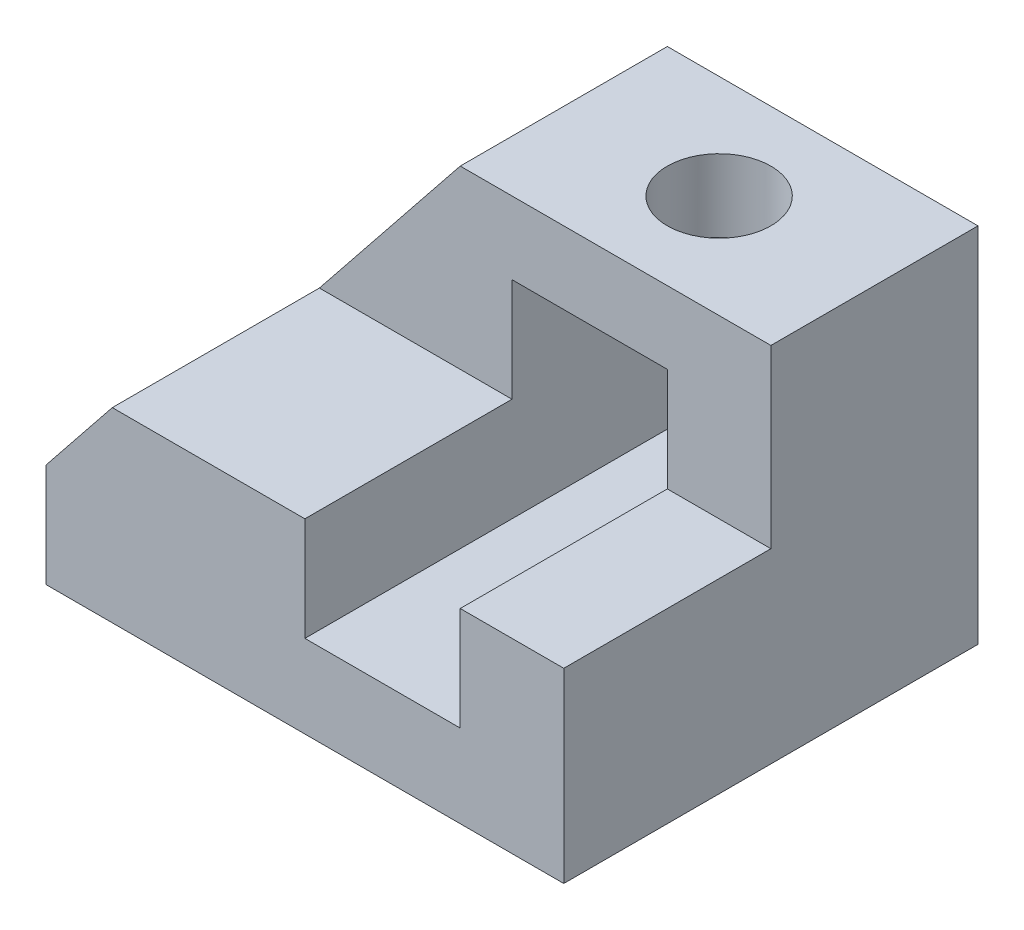
ISO-10303-21;
HEADER;
FILE_DESCRIPTION(('STEP AP214'),'2;1');
FILE_NAME('part.step','',(''),(''),'','','');
FILE_SCHEMA(('AUTOMOTIVE_DESIGN { 1 0 10303 214 1 1 1 1 }'));
ENDSEC;
DATA;
#1=APPLICATION_CONTEXT('core data for automotive mechanical design processes');
#2=APPLICATION_PROTOCOL_DEFINITION('international standard','automotive_design',2000,#1);
#3=PRODUCT_CONTEXT('',#1,'mechanical');
#4=PRODUCT('Part','Part','',(#3));
#5=PRODUCT_RELATED_PRODUCT_CATEGORY('part','',(#4));
#6=PRODUCT_DEFINITION_FORMATION('','',#4);
#7=PRODUCT_DEFINITION_CONTEXT('part definition',#1,'design');
#8=PRODUCT_DEFINITION('design','',#6,#7);
#9=PRODUCT_DEFINITION_SHAPE('','',#8);
#10=(LENGTH_UNIT() NAMED_UNIT(*) SI_UNIT(.MILLI.,.METRE.));
#11=(NAMED_UNIT(*) PLANE_ANGLE_UNIT() SI_UNIT($,.RADIAN.));
#12=(NAMED_UNIT(*) SI_UNIT($,.STERADIAN.) SOLID_ANGLE_UNIT());
#13=UNCERTAINTY_MEASURE_WITH_UNIT(LENGTH_MEASURE(1.E-05),#10,'distance_accuracy_value','');
#14=(GEOMETRIC_REPRESENTATION_CONTEXT(3) GLOBAL_UNCERTAINTY_ASSIGNED_CONTEXT((#13)) GLOBAL_UNIT_ASSIGNED_CONTEXT((#10,
#11,#12)) REPRESENTATION_CONTEXT('',''));
#15=CARTESIAN_POINT('',(0.,0.,0.));
#16=DIRECTION('',(0.,0.,1.));
#17=DIRECTION('',(1.,0.,0.));
#18=AXIS2_PLACEMENT_3D('',#15,#16,#17);
#19=CARTESIAN_POINT('',(0.,18.,40.));
#20=DIRECTION('',(0.,1.,0.));
#21=DIRECTION('',(0.,0.,1.));
#22=AXIS2_PLACEMENT_3D('',#19,#20,#21);
#23=PLANE('',#22);
#24=DIRECTION('',(1.,0.,0.));
#25=VECTOR('',#24,1.);
#26=CARTESIAN_POINT('',(0.,18.,20.));
#27=LINE('',#26,#25);
#28=CARTESIAN_POINT('',(40.,18.,20.));
#29=VERTEX_POINT('',#28);
#30=CARTESIAN_POINT('',(50.,18.,20.));
#31=VERTEX_POINT('',#30);
#32=EDGE_CURVE('E167',#29,#31,#27,.T.);
#33=ORIENTED_EDGE('',*,*,#32,.F.);
#34=DIRECTION('',(0.,0.,-1.));
#35=VECTOR('',#34,1.);
#36=CARTESIAN_POINT('',(40.,18.,40.));
#37=LINE('',#36,#35);
#38=CARTESIAN_POINT('',(40.,18.,40.));
#39=VERTEX_POINT('',#38);
#40=EDGE_CURVE('E13',#39,#29,#37,.T.);
#41=ORIENTED_EDGE('',*,*,#40,.F.);
#42=DIRECTION('',(1.,0.,0.));
#43=VECTOR('',#42,1.);
#44=CARTESIAN_POINT('',(0.,18.,40.));
#45=LINE('',#44,#43);
#46=CARTESIAN_POINT('',(50.,18.,40.));
#47=VERTEX_POINT('',#46);
#48=EDGE_CURVE('E191',#39,#47,#45,.T.);
#49=ORIENTED_EDGE('',*,*,#48,.T.);
#50=DIRECTION('',(0.,0.,-1.));
#51=VECTOR('',#50,1.);
#52=CARTESIAN_POINT('',(50.,18.,40.));
#53=LINE('',#52,#51);
#54=EDGE_CURVE('E211',#47,#31,#53,.T.);
#55=ORIENTED_EDGE('',*,*,#54,.T.);
#56=EDGE_LOOP('',(#33,#41,#49,#55));
#57=FACE_BOUND('',#56,.T.);
#58=ADVANCED_FACE('F61',(#57),#23,.T.);
#59=CARTESIAN_POINT('',(40.,0.,40.));
#60=DIRECTION('',(1.,0.,0.));
#61=DIRECTION('',(0.,0.,-1.));
#62=AXIS2_PLACEMENT_3D('',#59,#60,#61);
#63=PLANE('',#62);
#64=DIRECTION('',(0.,0.,-1.));
#65=VECTOR('',#64,1.);
#66=CARTESIAN_POINT('',(40.,8.,40.));
#67=LINE('',#66,#65);
#68=CARTESIAN_POINT('',(40.,8.,10.));
#69=VERTEX_POINT('',#68);
#70=CARTESIAN_POINT('',(40.,8.,0.));
#71=VERTEX_POINT('',#70);
#72=EDGE_CURVE('E243',#69,#71,#67,.T.);
#73=ORIENTED_EDGE('',*,*,#72,.F.);
#74=CARTESIAN_POINT('',(40.,8.,40.));
#75=VERTEX_POINT('',#74);
#76=EDGE_CURVE('E69',#75,#69,#67,.T.);
#77=ORIENTED_EDGE('',*,*,#76,.F.);
#78=DIRECTION('',(0.,-1.,0.));
#79=VECTOR('',#78,1.);
#80=CARTESIAN_POINT('',(40.,0.,40.));
#81=LINE('',#80,#79);
#82=EDGE_CURVE('E194',#39,#75,#81,.T.);
#83=ORIENTED_EDGE('',*,*,#82,.F.);
#84=ORIENTED_EDGE('',*,*,#40,.T.);
#85=DIRECTION('',(0.,-1.,0.));
#86=VECTOR('',#85,1.);
#87=CARTESIAN_POINT('',(40.,0.,20.));
#88=LINE('',#87,#86);
#89=CARTESIAN_POINT('',(40.,28.,20.));
#90=VERTEX_POINT('',#89);
#91=EDGE_CURVE('E159',#90,#29,#88,.T.);
#92=ORIENTED_EDGE('',*,*,#91,.F.);
#93=DIRECTION('',(0.,0.,-1.));
#94=VECTOR('',#93,1.);
#95=CARTESIAN_POINT('',(40.,28.,20.));
#96=LINE('',#95,#94);
#97=CARTESIAN_POINT('',(40.,28.,10.));
#98=VERTEX_POINT('',#97);
#99=EDGE_CURVE('E163',#90,#98,#96,.T.);
#100=ORIENTED_EDGE('',*,*,#99,.T.);
#101=CARTESIAN_POINT('',(40.,28.,0.));
#102=VERTEX_POINT('',#101);
#103=EDGE_CURVE('E182',#98,#102,#96,.T.);
#104=ORIENTED_EDGE('',*,*,#103,.T.);
#105=DIRECTION('',(0.,-1.,0.));
#106=VECTOR('',#105,1.);
#107=CARTESIAN_POINT('',(40.,0.,0.));
#108=LINE('',#107,#106);
#109=EDGE_CURVE('E181',#102,#71,#108,.T.);
#110=ORIENTED_EDGE('',*,*,#109,.T.);
#111=EDGE_LOOP('',(#73,#77,#83,#84,#92,#100,#104,#110));
#112=FACE_BOUND('',#111,.T.);
#113=ADVANCED_FACE('F63',(#112),#63,.F.);
#114=CARTESIAN_POINT('',(0.,8.,40.));
#115=DIRECTION('',(0.,1.,0.));
#116=DIRECTION('',(0.,0.,1.));
#117=AXIS2_PLACEMENT_3D('',#114,#115,#116);
#118=PLANE('',#117);
#119=ORIENTED_EDGE('',*,*,#76,.T.);
#120=CARTESIAN_POINT('',(35.,8.,10.));
#121=DIRECTION('',(0.,1.,0.));
#122=DIRECTION('',(0.,0.,1.));
#123=AXIS2_PLACEMENT_3D('',#120,#121,#122);
#124=CIRCLE('',#123,5.);
#125=EDGE_CURVE('E74',#69,#69,#124,.T.);
#126=ORIENTED_EDGE('',*,*,#125,.F.);
#127=ORIENTED_EDGE('',*,*,#72,.T.);
#128=DIRECTION('',(1.,0.,0.));
#129=VECTOR('',#128,1.);
#130=CARTESIAN_POINT('',(0.,8.,0.));
#131=LINE('',#130,#129);
#132=CARTESIAN_POINT('',(25.,8.,0.));
#133=VERTEX_POINT('',#132);
#134=EDGE_CURVE('E185',#133,#71,#131,.T.);
#135=ORIENTED_EDGE('',*,*,#134,.F.);
#136=DIRECTION('',(0.,0.,-1.));
#137=VECTOR('',#136,1.);
#138=CARTESIAN_POINT('',(25.,8.,40.));
#139=LINE('',#138,#137);
#140=CARTESIAN_POINT('',(25.,8.,40.));
#141=VERTEX_POINT('',#140);
#142=EDGE_CURVE('E242',#141,#133,#139,.T.);
#143=ORIENTED_EDGE('',*,*,#142,.F.);
#144=DIRECTION('',(1.,0.,0.));
#145=VECTOR('',#144,1.);
#146=CARTESIAN_POINT('',(0.,8.,40.));
#147=LINE('',#146,#145);
#148=EDGE_CURVE('E198',#141,#75,#147,.T.);
#149=ORIENTED_EDGE('',*,*,#148,.T.);
#150=EDGE_LOOP('',(#119,#126,#127,#135,#143,#149));
#151=FACE_BOUND('',#150,.T.);
#152=ADVANCED_FACE('F248',(#151),#118,.T.);
#153=CARTESIAN_POINT('',(25.,0.,40.));
#154=DIRECTION('',(1.,0.,0.));
#155=DIRECTION('',(0.,1.,0.));
#156=AXIS2_PLACEMENT_3D('',#153,#154,#155);
#157=PLANE('',#156);
#158=DIRECTION('',(0.,-1.,0.));
#159=VECTOR('',#158,1.);
#160=CARTESIAN_POINT('',(25.,0.,0.));
#161=LINE('',#160,#159);
#162=CARTESIAN_POINT('',(25.,28.,0.));
#163=VERTEX_POINT('',#162);
#164=EDGE_CURVE('E215',#163,#133,#161,.T.);
#165=ORIENTED_EDGE('',*,*,#164,.F.);
#166=DIRECTION('',(0.,0.,-1.));
#167=VECTOR('',#166,1.);
#168=CARTESIAN_POINT('',(25.,28.,20.));
#169=LINE('',#168,#167);
#170=CARTESIAN_POINT('',(25.,28.,20.));
#171=VERTEX_POINT('',#170);
#172=EDGE_CURVE('E257',#171,#163,#169,.T.);
#173=ORIENTED_EDGE('',*,*,#172,.F.);
#174=DIRECTION('',(0.,-1.,0.));
#175=VECTOR('',#174,1.);
#176=CARTESIAN_POINT('',(25.,0.,20.));
#177=LINE('',#176,#175);
#178=CARTESIAN_POINT('',(25.,18.,20.));
#179=VERTEX_POINT('',#178);
#180=EDGE_CURVE('E174',#171,#179,#177,.T.);
#181=ORIENTED_EDGE('',*,*,#180,.T.);
#182=DIRECTION('',(0.,0.,-1.));
#183=VECTOR('',#182,1.);
#184=CARTESIAN_POINT('',(25.,18.,40.));
#185=LINE('',#184,#183);
#186=CARTESIAN_POINT('',(25.,18.,40.));
#187=VERTEX_POINT('',#186);
#188=EDGE_CURVE('E239',#187,#179,#185,.T.);
#189=ORIENTED_EDGE('',*,*,#188,.F.);
#190=DIRECTION('',(0.,-1.,0.));
#191=VECTOR('',#190,1.);
#192=CARTESIAN_POINT('',(25.,0.,40.));
#193=LINE('',#192,#191);
#194=EDGE_CURVE('E201',#187,#141,#193,.T.);
#195=ORIENTED_EDGE('',*,*,#194,.T.);
#196=ORIENTED_EDGE('',*,*,#142,.T.);
#197=EDGE_LOOP('',(#165,#173,#181,#189,#195,#196));
#198=FACE_BOUND('',#197,.T.);
#199=ADVANCED_FACE('F256',(#198),#157,.T.);
#200=CARTESIAN_POINT('',(6.4,18.,20.));
#201=VERTEX_POINT('',#200);
#202=EDGE_CURVE('E261',#201,#179,#27,.T.);
#203=ORIENTED_EDGE('',*,*,#202,.F.);
#204=DIRECTION('',(0.,0.,-1.));
#205=VECTOR('',#204,1.);
#206=CARTESIAN_POINT('',(6.4,18.,40.));
#207=LINE('',#206,#205);
#208=CARTESIAN_POINT('',(6.4,18.,40.));
#209=VERTEX_POINT('',#208);
#210=EDGE_CURVE('E236',#209,#201,#207,.T.);
#211=ORIENTED_EDGE('',*,*,#210,.F.);
#212=EDGE_CURVE('E196',#209,#187,#45,.T.);
#213=ORIENTED_EDGE('',*,*,#212,.T.);
#214=ORIENTED_EDGE('',*,*,#188,.T.);
#215=EDGE_LOOP('',(#203,#211,#213,#214));
#216=FACE_BOUND('',#215,.T.);
#217=ADVANCED_FACE('F298',(#216),#23,.T.);
#218=CARTESIAN_POINT('',(-4.87804878048781,3.90243902439025,40.));
#219=DIRECTION('',(0.78086880944303,-0.624695047554425,0.));
#220=DIRECTION('',(0.624695047554425,0.78086880944303,0.));
#221=AXIS2_PLACEMENT_3D('',#218,#219,#220);
#222=PLANE('',#221);
#223=DIRECTION('',(-0.624695047554425,-0.78086880944303,0.));
#224=VECTOR('',#223,1.);
#225=CARTESIAN_POINT('',(-4.87804878048781,3.90243902439025,0.));
#226=LINE('',#225,#224);
#227=CARTESIAN_POINT('',(20.,35.,0.));
#228=VERTEX_POINT('',#227);
#229=CARTESIAN_POINT('',(0.,10.,0.));
#230=VERTEX_POINT('',#229);
#231=EDGE_CURVE('E218',#228,#230,#226,.T.);
#232=ORIENTED_EDGE('',*,*,#231,.T.);
#233=DIRECTION('',(0.,0.,-1.));
#234=VECTOR('',#233,1.);
#235=CARTESIAN_POINT('',(0.,10.,40.));
#236=LINE('',#235,#234);
#237=CARTESIAN_POINT('',(0.,10.,40.));
#238=VERTEX_POINT('',#237);
#239=EDGE_CURVE('E233',#238,#230,#236,.T.);
#240=ORIENTED_EDGE('',*,*,#239,.F.);
#241=DIRECTION('',(-0.624695047554425,-0.78086880944303,0.));
#242=VECTOR('',#241,1.);
#243=CARTESIAN_POINT('',(-4.87804878048781,3.90243902439025,40.));
#244=LINE('',#243,#242);
#245=EDGE_CURVE('E204',#209,#238,#244,.T.);
#246=ORIENTED_EDGE('',*,*,#245,.F.);
#247=ORIENTED_EDGE('',*,*,#210,.T.);
#248=DIRECTION('',(-0.624695047554425,-0.78086880944303,0.));
#249=VECTOR('',#248,1.);
#250=CARTESIAN_POINT('',(-4.87804878048781,3.90243902439025,20.));
#251=LINE('',#250,#249);
#252=CARTESIAN_POINT('',(20.,35.,20.));
#253=VERTEX_POINT('',#252);
#254=EDGE_CURVE('E267',#253,#201,#251,.T.);
#255=ORIENTED_EDGE('',*,*,#254,.F.);
#256=DIRECTION('',(0.,0.,-1.));
#257=VECTOR('',#256,1.);
#258=CARTESIAN_POINT('',(20.,35.,20.));
#259=LINE('',#258,#257);
#260=EDGE_CURVE('E258',#253,#228,#259,.T.);
#261=ORIENTED_EDGE('',*,*,#260,.T.);
#262=EDGE_LOOP('',(#232,#240,#246,#247,#255,#261));
#263=FACE_BOUND('',#262,.T.);
#264=ADVANCED_FACE('F307',(#263),#222,.F.);
#265=CARTESIAN_POINT('',(0.,0.,40.));
#266=DIRECTION('',(1.,0.,0.));
#267=DIRECTION('',(0.,1.,0.));
#268=AXIS2_PLACEMENT_3D('',#265,#266,#267);
#269=PLANE('',#268);
#270=DIRECTION('',(0.,-1.,0.));
#271=VECTOR('',#270,1.);
#272=CARTESIAN_POINT('',(0.,0.,0.));
#273=LINE('',#272,#271);
#274=CARTESIAN_POINT('',(0.,0.,0.));
#275=VERTEX_POINT('',#274);
#276=EDGE_CURVE('E220',#230,#275,#273,.T.);
#277=ORIENTED_EDGE('',*,*,#276,.T.);
#278=DIRECTION('',(0.,0.,-1.));
#279=VECTOR('',#278,1.);
#280=CARTESIAN_POINT('',(0.,0.,40.));
#281=LINE('',#280,#279);
#282=CARTESIAN_POINT('',(0.,0.,40.));
#283=VERTEX_POINT('',#282);
#284=EDGE_CURVE('E230',#283,#275,#281,.T.);
#285=ORIENTED_EDGE('',*,*,#284,.F.);
#286=DIRECTION('',(0.,-1.,0.));
#287=VECTOR('',#286,1.);
#288=CARTESIAN_POINT('',(0.,0.,40.));
#289=LINE('',#288,#287);
#290=EDGE_CURVE('E206',#238,#283,#289,.T.);
#291=ORIENTED_EDGE('',*,*,#290,.F.);
#292=ORIENTED_EDGE('',*,*,#239,.T.);
#293=EDGE_LOOP('',(#277,#285,#291,#292));
#294=FACE_BOUND('',#293,.T.);
#295=ADVANCED_FACE('F312',(#294),#269,.F.);
#296=CARTESIAN_POINT('',(0.,0.,40.));
#297=DIRECTION('',(0.,1.,0.));
#298=DIRECTION('',(0.,0.,1.));
#299=AXIS2_PLACEMENT_3D('',#296,#297,#298);
#300=PLANE('',#299);
#301=CARTESIAN_POINT('',(35.,0.,10.));
#302=DIRECTION('',(0.,1.,0.));
#303=DIRECTION('',(-1.,0.,0.));
#304=AXIS2_PLACEMENT_3D('',#301,#302,#303);
#305=CIRCLE('',#304,5.);
#306=CARTESIAN_POINT('',(30.,0.,10.));
#307=VERTEX_POINT('',#306);
#308=EDGE_CURVE('E276',#307,#307,#305,.T.);
#309=ORIENTED_EDGE('',*,*,#308,.T.);
#310=EDGE_LOOP('',(#309));
#311=FACE_BOUND('',#310,.T.);
#312=DIRECTION('',(1.,0.,0.));
#313=VECTOR('',#312,1.);
#314=CARTESIAN_POINT('',(0.,0.,0.));
#315=LINE('',#314,#313);
#316=CARTESIAN_POINT('',(50.,0.,0.));
#317=VERTEX_POINT('',#316);
#318=EDGE_CURVE('E222',#275,#317,#315,.T.);
#319=ORIENTED_EDGE('',*,*,#318,.T.);
#320=DIRECTION('',(0.,0.,-1.));
#321=VECTOR('',#320,1.);
#322=CARTESIAN_POINT('',(50.,0.,40.));
#323=LINE('',#322,#321);
#324=CARTESIAN_POINT('',(50.,0.,40.));
#325=VERTEX_POINT('',#324);
#326=EDGE_CURVE('E227',#325,#317,#323,.T.);
#327=ORIENTED_EDGE('',*,*,#326,.F.);
#328=DIRECTION('',(1.,0.,0.));
#329=VECTOR('',#328,1.);
#330=CARTESIAN_POINT('',(0.,0.,40.));
#331=LINE('',#330,#329);
#332=EDGE_CURVE('E208',#283,#325,#331,.T.);
#333=ORIENTED_EDGE('',*,*,#332,.F.);
#334=ORIENTED_EDGE('',*,*,#284,.T.);
#335=EDGE_LOOP('',(#319,#327,#333,#334));
#336=FACE_BOUND('',#335,.T.);
#337=ADVANCED_FACE('F283',(#311,#336),#300,.F.);
#338=CARTESIAN_POINT('',(50.,0.,40.));
#339=DIRECTION('',(-1.,0.,0.));
#340=DIRECTION('',(0.,0.,1.));
#341=AXIS2_PLACEMENT_3D('',#338,#339,#340);
#342=PLANE('',#341);
#343=DIRECTION('',(0.,1.,0.));
#344=VECTOR('',#343,1.);
#345=CARTESIAN_POINT('',(50.,0.,0.));
#346=LINE('',#345,#344);
#347=CARTESIAN_POINT('',(50.,35.,0.));
#348=VERTEX_POINT('',#347);
#349=EDGE_CURVE('E195',#317,#348,#346,.T.);
#350=ORIENTED_EDGE('',*,*,#349,.T.);
#351=DIRECTION('',(0.,0.,-1.));
#352=VECTOR('',#351,1.);
#353=CARTESIAN_POINT('',(50.,35.,20.));
#354=LINE('',#353,#352);
#355=CARTESIAN_POINT('',(50.,35.,20.));
#356=VERTEX_POINT('',#355);
#357=EDGE_CURVE('E187',#356,#348,#354,.T.);
#358=ORIENTED_EDGE('',*,*,#357,.F.);
#359=DIRECTION('',(0.,1.,0.));
#360=VECTOR('',#359,1.);
#361=CARTESIAN_POINT('',(50.,0.,20.));
#362=LINE('',#361,#360);
#363=EDGE_CURVE('E271',#31,#356,#362,.T.);
#364=ORIENTED_EDGE('',*,*,#363,.F.);
#365=ORIENTED_EDGE('',*,*,#54,.F.);
#366=DIRECTION('',(0.,1.,0.));
#367=VECTOR('',#366,1.);
#368=CARTESIAN_POINT('',(50.,0.,40.));
#369=LINE('',#368,#367);
#370=EDGE_CURVE('E210',#325,#47,#369,.T.);
#371=ORIENTED_EDGE('',*,*,#370,.F.);
#372=ORIENTED_EDGE('',*,*,#326,.T.);
#373=EDGE_LOOP('',(#350,#358,#364,#365,#371,#372));
#374=FACE_BOUND('',#373,.T.);
#375=ADVANCED_FACE('F331',(#374),#342,.F.);
#376=CARTESIAN_POINT('',(0.,0.,40.));
#377=DIRECTION('',(0.,0.,1.));
#378=DIRECTION('',(1.,0.,0.));
#379=AXIS2_PLACEMENT_3D('',#376,#377,#378);
#380=PLANE('',#379);
#381=ORIENTED_EDGE('',*,*,#48,.F.);
#382=ORIENTED_EDGE('',*,*,#82,.T.);
#383=ORIENTED_EDGE('',*,*,#148,.F.);
#384=ORIENTED_EDGE('',*,*,#194,.F.);
#385=ORIENTED_EDGE('',*,*,#212,.F.);
#386=ORIENTED_EDGE('',*,*,#245,.T.);
#387=ORIENTED_EDGE('',*,*,#290,.T.);
#388=ORIENTED_EDGE('',*,*,#332,.T.);
#389=ORIENTED_EDGE('',*,*,#370,.T.);
#390=EDGE_LOOP('',(#381,#382,#383,#384,#385,#386,#387,#388,#389));
#391=FACE_BOUND('',#390,.T.);
#392=ADVANCED_FACE('F324',(#391),#380,.T.);
#393=CARTESIAN_POINT('',(0.,0.,0.));
#394=DIRECTION('',(0.,0.,1.));
#395=DIRECTION('',(1.,0.,0.));
#396=AXIS2_PLACEMENT_3D('',#393,#394,#395);
#397=PLANE('',#396);
#398=DIRECTION('',(-1.,0.,0.));
#399=VECTOR('',#398,1.);
#400=CARTESIAN_POINT('',(0.,35.,0.));
#401=LINE('',#400,#399);
#402=EDGE_CURVE('E177',#348,#228,#401,.T.);
#403=ORIENTED_EDGE('',*,*,#402,.F.);
#404=ORIENTED_EDGE('',*,*,#349,.F.);
#405=ORIENTED_EDGE('',*,*,#318,.F.);
#406=ORIENTED_EDGE('',*,*,#276,.F.);
#407=ORIENTED_EDGE('',*,*,#231,.F.);
#408=EDGE_LOOP('',(#403,#404,#405,#406,#407));
#409=FACE_BOUND('',#408,.T.);
#410=ORIENTED_EDGE('',*,*,#109,.F.);
#411=DIRECTION('',(1.,0.,0.));
#412=VECTOR('',#411,1.);
#413=CARTESIAN_POINT('',(0.,28.,0.));
#414=LINE('',#413,#412);
#415=EDGE_CURVE('E254',#163,#102,#414,.T.);
#416=ORIENTED_EDGE('',*,*,#415,.F.);
#417=ORIENTED_EDGE('',*,*,#164,.T.);
#418=ORIENTED_EDGE('',*,*,#134,.T.);
#419=EDGE_LOOP('',(#410,#416,#417,#418));
#420=FACE_BOUND('',#419,.T.);
#421=ADVANCED_FACE('F253',(#409,#420),#397,.F.);
#422=CARTESIAN_POINT('',(0.,28.,20.));
#423=DIRECTION('',(0.,1.,0.));
#424=DIRECTION('',(0.,0.,1.));
#425=AXIS2_PLACEMENT_3D('',#422,#423,#424);
#426=PLANE('',#425);
#427=ORIENTED_EDGE('',*,*,#103,.F.);
#428=CARTESIAN_POINT('',(35.,28.,10.));
#429=DIRECTION('',(0.,1.,0.));
#430=DIRECTION('',(0.,0.,1.));
#431=AXIS2_PLACEMENT_3D('',#428,#429,#430);
#432=CIRCLE('',#431,5.);
#433=EDGE_CURVE('E79',#98,#98,#432,.T.);
#434=ORIENTED_EDGE('',*,*,#433,.T.);
#435=ORIENTED_EDGE('',*,*,#99,.F.);
#436=DIRECTION('',(1.,0.,0.));
#437=VECTOR('',#436,1.);
#438=CARTESIAN_POINT('',(0.,28.,20.));
#439=LINE('',#438,#437);
#440=EDGE_CURVE('E168',#171,#90,#439,.T.);
#441=ORIENTED_EDGE('',*,*,#440,.F.);
#442=ORIENTED_EDGE('',*,*,#172,.T.);
#443=ORIENTED_EDGE('',*,*,#415,.T.);
#444=EDGE_LOOP('',(#427,#434,#435,#441,#442,#443));
#445=FACE_BOUND('',#444,.T.);
#446=ADVANCED_FACE('F180',(#445),#426,.F.);
#447=CARTESIAN_POINT('',(0.,35.,20.));
#448=DIRECTION('',(0.,-1.,0.));
#449=DIRECTION('',(1.,0.,0.));
#450=AXIS2_PLACEMENT_3D('',#447,#448,#449);
#451=PLANE('',#450);
#452=CARTESIAN_POINT('',(35.,35.,10.));
#453=DIRECTION('',(0.,1.,0.));
#454=DIRECTION('',(-1.,0.,0.));
#455=AXIS2_PLACEMENT_3D('',#452,#453,#454);
#456=CIRCLE('',#455,5.);
#457=CARTESIAN_POINT('',(30.,35.,10.));
#458=VERTEX_POINT('',#457);
#459=EDGE_CURVE('E277',#458,#458,#456,.T.);
#460=ORIENTED_EDGE('',*,*,#459,.F.);
#461=EDGE_LOOP('',(#460));
#462=FACE_BOUND('',#461,.T.);
#463=ORIENTED_EDGE('',*,*,#402,.T.);
#464=ORIENTED_EDGE('',*,*,#260,.F.);
#465=DIRECTION('',(-1.,0.,0.));
#466=VECTOR('',#465,1.);
#467=CARTESIAN_POINT('',(0.,35.,20.));
#468=LINE('',#467,#466);
#469=EDGE_CURVE('E269',#356,#253,#468,.T.);
#470=ORIENTED_EDGE('',*,*,#469,.F.);
#471=ORIENTED_EDGE('',*,*,#357,.T.);
#472=EDGE_LOOP('',(#463,#464,#470,#471));
#473=FACE_BOUND('',#472,.T.);
#474=ADVANCED_FACE('F338',(#462,#473),#451,.F.);
#475=CARTESIAN_POINT('',(0.,0.,20.));
#476=DIRECTION('',(0.,0.,1.));
#477=DIRECTION('',(1.,0.,0.));
#478=AXIS2_PLACEMENT_3D('',#475,#476,#477);
#479=PLANE('',#478);
#480=ORIENTED_EDGE('',*,*,#440,.T.);
#481=ORIENTED_EDGE('',*,*,#91,.T.);
#482=ORIENTED_EDGE('',*,*,#32,.T.);
#483=ORIENTED_EDGE('',*,*,#363,.T.);
#484=ORIENTED_EDGE('',*,*,#469,.T.);
#485=ORIENTED_EDGE('',*,*,#254,.T.);
#486=ORIENTED_EDGE('',*,*,#202,.T.);
#487=ORIENTED_EDGE('',*,*,#180,.F.);
#488=EDGE_LOOP('',(#480,#481,#482,#483,#484,#485,#486,#487));
#489=FACE_BOUND('',#488,.T.);
#490=ADVANCED_FACE('F172',(#489),#479,.T.);
#491=CARTESIAN_POINT('',(35.,0.,10.));
#492=DIRECTION('',(0.,1.,0.));
#493=DIRECTION('',(-1.,0.,0.));
#494=AXIS2_PLACEMENT_3D('',#491,#492,#493);
#495=CYLINDRICAL_SURFACE('',#494,5.);
#496=ORIENTED_EDGE('',*,*,#459,.T.);
#497=EDGE_LOOP('',(#496));
#498=FACE_BOUND('',#497,.T.);
#499=ORIENTED_EDGE('',*,*,#433,.F.);
#500=EDGE_LOOP('',(#499));
#501=FACE_BOUND('',#500,.T.);
#502=ADVANCED_FACE('F288',(#498,#501),#495,.F.);
#503=ORIENTED_EDGE('',*,*,#125,.T.);
#504=EDGE_LOOP('',(#503));
#505=FACE_BOUND('',#504,.T.);
#506=ORIENTED_EDGE('',*,*,#308,.F.);
#507=EDGE_LOOP('',(#506));
#508=FACE_BOUND('',#507,.T.);
#509=ADVANCED_FACE('F286',(#505,#508),#495,.F.);
#510=CLOSED_SHELL('',(#58,#113,#152,#199,#217,#264,#295,#337,#375,#392,#421,#446,#474,#490,#502,#509));
#511=MANIFOLD_SOLID_BREP('B2',#510);
#512=ADVANCED_BREP_SHAPE_REPRESENTATION('',(#18,#511),#14);
#513=SHAPE_DEFINITION_REPRESENTATION(#9,#512);
ENDSEC;
END-ISO-10303-21;
